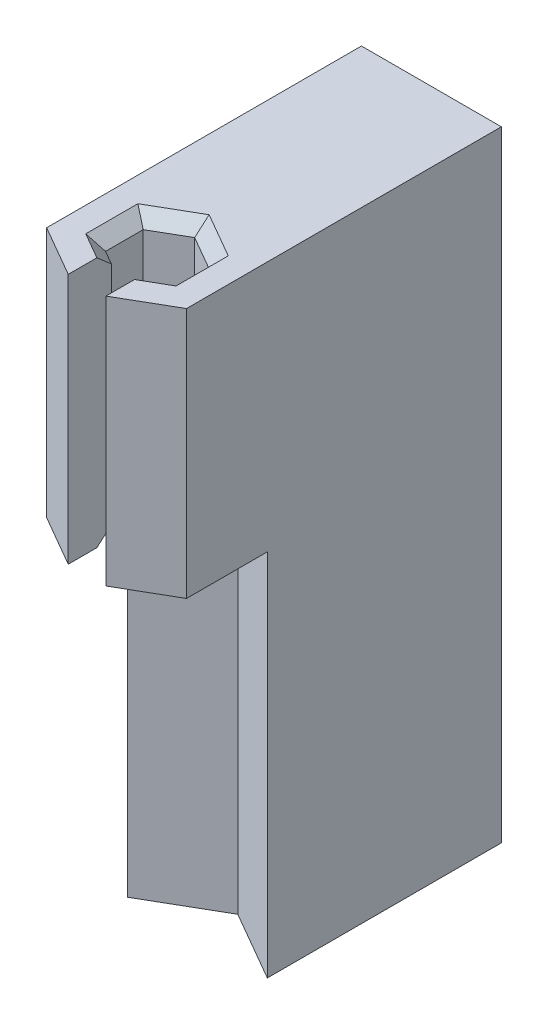
ISO-10303-21;
HEADER;
FILE_DESCRIPTION(('STEP AP214'),'2;1');
FILE_NAME('part.step','',(''),(''),'','','');
FILE_SCHEMA(('AUTOMOTIVE_DESIGN { 1 0 10303 214 1 1 1 1 }'));
ENDSEC;
DATA;
#1=APPLICATION_CONTEXT('core data for automotive mechanical design processes');
#2=APPLICATION_PROTOCOL_DEFINITION('international standard','automotive_design',2000,#1);
#3=PRODUCT_CONTEXT('',#1,'mechanical');
#4=PRODUCT('Part','Part','',(#3));
#5=PRODUCT_RELATED_PRODUCT_CATEGORY('part','',(#4));
#6=PRODUCT_DEFINITION_FORMATION('','',#4);
#7=PRODUCT_DEFINITION_CONTEXT('part definition',#1,'design');
#8=PRODUCT_DEFINITION('design','',#6,#7);
#9=PRODUCT_DEFINITION_SHAPE('','',#8);
#10=(LENGTH_UNIT() NAMED_UNIT(*) SI_UNIT(.MILLI.,.METRE.));
#11=(NAMED_UNIT(*) PLANE_ANGLE_UNIT() SI_UNIT($,.RADIAN.));
#12=(NAMED_UNIT(*) SI_UNIT($,.STERADIAN.) SOLID_ANGLE_UNIT());
#13=UNCERTAINTY_MEASURE_WITH_UNIT(LENGTH_MEASURE(1.E-05),#10,'distance_accuracy_value','');
#14=(GEOMETRIC_REPRESENTATION_CONTEXT(3) GLOBAL_UNCERTAINTY_ASSIGNED_CONTEXT((#13)) GLOBAL_UNIT_ASSIGNED_CONTEXT((#10,
#11,#12)) REPRESENTATION_CONTEXT('',''));
#15=CARTESIAN_POINT('',(0.,0.,0.));
#16=DIRECTION('',(0.,0.,1.));
#17=DIRECTION('',(1.,0.,0.));
#18=AXIS2_PLACEMENT_3D('',#15,#16,#17);
#19=CARTESIAN_POINT('',(40.2,84.02,15.9));
#20=DIRECTION('',(0.,0.,1.));
#21=DIRECTION('',(1.,0.,0.));
#22=AXIS2_PLACEMENT_3D('',#19,#20,#21);
#23=PLANE('',#22);
#24=CARTESIAN_POINT('',(63.1646241460588,78.45,15.9));
#25=DIRECTION('',(0.,0.,-1.));
#26=DIRECTION('',(-1.,0.,0.));
#27=AXIS2_PLACEMENT_3D('',#24,#25,#26);
#28=CIRCLE('',#27,0.999999999999998);
#29=CARTESIAN_POINT('',(62.1646241460588,78.45,15.9));
#30=VERTEX_POINT('',#29);
#31=EDGE_CURVE('E420',#30,#30,#28,.T.);
#32=ORIENTED_EDGE('',*,*,#31,.F.);
#33=EDGE_LOOP('',(#32));
#34=FACE_BOUND('',#33,.T.);
#35=DIRECTION('',(1.,0.,0.));
#36=VECTOR('',#35,1.);
#37=CARTESIAN_POINT('',(0.,84.02,15.9));
#38=LINE('',#37,#36);
#39=CARTESIAN_POINT('',(55.4888771993531,84.02,15.9));
#40=VERTEX_POINT('',#39);
#41=CARTESIAN_POINT('',(66.6346241460589,84.02,15.9));
#42=VERTEX_POINT('',#41);
#43=EDGE_CURVE('E11',#40,#42,#38,.T.);
#44=ORIENTED_EDGE('',*,*,#43,.T.);
#45=DIRECTION('',(0.,1.,0.));
#46=VECTOR('',#45,1.);
#47=CARTESIAN_POINT('',(66.6346241460589,84.0200000000001,15.9));
#48=LINE('',#47,#46);
#49=CARTESIAN_POINT('',(66.6346241460588,34.62,15.9));
#50=VERTEX_POINT('',#49);
#51=EDGE_CURVE('E63',#50,#42,#48,.T.);
#52=ORIENTED_EDGE('',*,*,#51,.F.);
#53=DIRECTION('',(1.,0.,0.));
#54=VECTOR('',#53,1.);
#55=CARTESIAN_POINT('',(0.,34.62,15.9));
#56=LINE('',#55,#54);
#57=CARTESIAN_POINT('',(55.4888771993531,34.62,15.9));
#58=VERTEX_POINT('',#57);
#59=EDGE_CURVE('E315',#58,#50,#56,.T.);
#60=ORIENTED_EDGE('',*,*,#59,.F.);
#61=DIRECTION('',(0.,-1.,0.));
#62=VECTOR('',#61,1.);
#63=CARTESIAN_POINT('',(55.4888771993531,84.0200000000001,15.9));
#64=LINE('',#63,#62);
#65=EDGE_CURVE('E50',#40,#58,#64,.T.);
#66=ORIENTED_EDGE('',*,*,#65,.F.);
#67=EDGE_LOOP('',(#44,#52,#60,#66));
#68=FACE_BOUND('',#67,.T.);
#69=ADVANCED_FACE('F43',(#34,#68),#23,.F.);
#70=CARTESIAN_POINT('',(61.061750672706,84.0200000000001,40.7599999999998));
#71=DIRECTION('',(-0.5,0.,-0.866025403784438));
#72=DIRECTION('',(-0.866025403784439,0.,0.5));
#73=AXIS2_PLACEMENT_3D('',#70,#71,#72);
#74=PLANE('',#73);
#75=DIRECTION('',(0.,-1.,0.));
#76=VECTOR('',#75,1.);
#77=CARTESIAN_POINT('',(63.6598268840593,84.0200000000001,39.2599999999998));
#78=LINE('',#77,#76);
#79=CARTESIAN_POINT('',(63.6598268840593,83.0200000000001,39.2599999999998));
#80=VERTEX_POINT('',#79);
#81=CARTESIAN_POINT('',(63.6598268840593,65.0200000000001,39.2599999999999));
#82=VERTEX_POINT('',#81);
#83=EDGE_CURVE('E241',#80,#82,#78,.T.);
#84=ORIENTED_EDGE('',*,*,#83,.T.);
#85=DIRECTION('',(-0.866025403784439,0.,0.5));
#86=VECTOR('',#85,1.);
#87=CARTESIAN_POINT('',(62.561750672706,65.0200000000001,39.8939745962155));
#88=LINE('',#87,#86);
#89=CARTESIAN_POINT('',(62.561750672706,65.0200000000001,39.8939745962155));
#90=VERTEX_POINT('',#89);
#91=EDGE_CURVE('E285',#82,#90,#88,.T.);
#92=ORIENTED_EDGE('',*,*,#91,.T.);
#93=DIRECTION('',(0.,-1.,0.));
#94=VECTOR('',#93,1.);
#95=CARTESIAN_POINT('',(62.561750672706,84.0200000000001,39.8939745962154));
#96=LINE('',#95,#94);
#97=CARTESIAN_POINT('',(62.561750672706,83.0200000000002,39.8939745962154));
#98=VERTEX_POINT('',#97);
#99=EDGE_CURVE('E255',#98,#90,#96,.T.);
#100=ORIENTED_EDGE('',*,*,#99,.F.);
#101=DIRECTION('',(0.866025403784439,0.,-0.5));
#102=VECTOR('',#101,1.);
#103=CARTESIAN_POINT('',(61.061750672706,83.0200000000002,40.7599999999998));
#104=LINE('',#103,#102);
#105=EDGE_CURVE('E282',#98,#80,#104,.T.);
#106=ORIENTED_EDGE('',*,*,#105,.T.);
#107=EDGE_LOOP('',(#84,#92,#100,#106));
#108=FACE_BOUND('',#107,.T.);
#109=ADVANCED_FACE('F390',(#108),#74,.T.);
#110=CARTESIAN_POINT('',(63.6598268840593,84.0200000000001,39.2599999999998));
#111=DIRECTION('',(-1.,0.,0.));
#112=DIRECTION('',(0.,0.,1.));
#113=AXIS2_PLACEMENT_3D('',#110,#111,#112);
#114=PLANE('',#113);
#115=DIRECTION('',(0.,-1.,0.));
#116=VECTOR('',#115,1.);
#117=CARTESIAN_POINT('',(63.6598268840593,84.0200000000001,36.2599999999998));
#118=LINE('',#117,#116);
#119=CARTESIAN_POINT('',(63.6598268840593,83.0200000000001,36.2599999999998));
#120=VERTEX_POINT('',#119);
#121=CARTESIAN_POINT('',(63.6598268840593,65.0200000000001,36.2599999999999));
#122=VERTEX_POINT('',#121);
#123=EDGE_CURVE('E384',#120,#122,#118,.T.);
#124=ORIENTED_EDGE('',*,*,#123,.T.);
#125=DIRECTION('',(0.,0.,1.));
#126=VECTOR('',#125,1.);
#127=CARTESIAN_POINT('',(63.6598268840593,65.0200000000001,39.2599999999999));
#128=LINE('',#127,#126);
#129=EDGE_CURVE('E293',#122,#82,#128,.T.);
#130=ORIENTED_EDGE('',*,*,#129,.T.);
#131=ORIENTED_EDGE('',*,*,#83,.F.);
#132=DIRECTION('',(0.,0.,-1.));
#133=VECTOR('',#132,1.);
#134=CARTESIAN_POINT('',(63.6598268840593,83.0200000000001,39.2599999999998));
#135=LINE('',#134,#133);
#136=EDGE_CURVE('E291',#80,#120,#135,.T.);
#137=ORIENTED_EDGE('',*,*,#136,.T.);
#138=EDGE_LOOP('',(#124,#130,#131,#137));
#139=FACE_BOUND('',#138,.T.);
#140=ADVANCED_FACE('F440',(#139),#114,.T.);
#141=CARTESIAN_POINT('',(63.6598268840593,84.0200000000001,36.2599999999998));
#142=DIRECTION('',(-0.499999999999997,0.,0.866025403784441));
#143=DIRECTION('',(0.866025403784441,0.,0.499999999999997));
#144=AXIS2_PLACEMENT_3D('',#141,#142,#143);
#145=PLANE('',#144);
#146=DIRECTION('',(0.,-1.,0.));
#147=VECTOR('',#146,1.);
#148=CARTESIAN_POINT('',(61.061750672706,84.0200000000001,34.7599999999998));
#149=LINE('',#148,#147);
#150=CARTESIAN_POINT('',(61.061750672706,83.0200000000001,34.7599999999998));
#151=VERTEX_POINT('',#150);
#152=CARTESIAN_POINT('',(61.061750672706,65.0200000000001,34.7599999999999));
#153=VERTEX_POINT('',#152);
#154=EDGE_CURVE('E381',#151,#153,#149,.T.);
#155=ORIENTED_EDGE('',*,*,#154,.T.);
#156=DIRECTION('',(0.866025403784441,0.,0.499999999999997));
#157=VECTOR('',#156,1.);
#158=CARTESIAN_POINT('',(63.6598268840593,65.0200000000001,36.2599999999999));
#159=LINE('',#158,#157);
#160=EDGE_CURVE('E297',#153,#122,#159,.T.);
#161=ORIENTED_EDGE('',*,*,#160,.T.);
#162=ORIENTED_EDGE('',*,*,#123,.F.);
#163=DIRECTION('',(-0.866025403784441,0.,-0.499999999999997));
#164=VECTOR('',#163,1.);
#165=CARTESIAN_POINT('',(63.6598268840593,83.0200000000001,36.2599999999998));
#166=LINE('',#165,#164);
#167=EDGE_CURVE('E295',#120,#151,#166,.T.);
#168=ORIENTED_EDGE('',*,*,#167,.T.);
#169=EDGE_LOOP('',(#155,#161,#162,#168));
#170=FACE_BOUND('',#169,.T.);
#171=ADVANCED_FACE('F468',(#170),#145,.T.);
#172=CARTESIAN_POINT('',(61.061750672706,84.0200000000001,34.7599999999998));
#173=DIRECTION('',(0.500000000000003,0.,0.866025403784437));
#174=DIRECTION('',(0.866025403784437,0.,-0.500000000000003));
#175=AXIS2_PLACEMENT_3D('',#172,#173,#174);
#176=PLANE('',#175);
#177=DIRECTION('',(0.,-1.,0.));
#178=VECTOR('',#177,1.);
#179=CARTESIAN_POINT('',(58.4636744613527,84.0200000000001,36.2599999999998));
#180=LINE('',#179,#178);
#181=CARTESIAN_POINT('',(58.4636744613527,83.0200000000001,36.2599999999998));
#182=VERTEX_POINT('',#181);
#183=CARTESIAN_POINT('',(58.4636744613527,65.0200000000001,36.2599999999999));
#184=VERTEX_POINT('',#183);
#185=EDGE_CURVE('E378',#182,#184,#180,.T.);
#186=ORIENTED_EDGE('',*,*,#185,.T.);
#187=DIRECTION('',(0.866025403784437,0.,-0.500000000000003));
#188=VECTOR('',#187,1.);
#189=CARTESIAN_POINT('',(61.061750672706,65.0200000000001,34.7599999999999));
#190=LINE('',#189,#188);
#191=EDGE_CURVE('E301',#184,#153,#190,.T.);
#192=ORIENTED_EDGE('',*,*,#191,.T.);
#193=ORIENTED_EDGE('',*,*,#154,.F.);
#194=DIRECTION('',(-0.866025403784437,0.,0.500000000000003));
#195=VECTOR('',#194,1.);
#196=CARTESIAN_POINT('',(61.061750672706,83.0200000000001,34.7599999999998));
#197=LINE('',#196,#195);
#198=EDGE_CURVE('E299',#151,#182,#197,.T.);
#199=ORIENTED_EDGE('',*,*,#198,.T.);
#200=EDGE_LOOP('',(#186,#192,#193,#199));
#201=FACE_BOUND('',#200,.T.);
#202=ADVANCED_FACE('F464',(#201),#176,.T.);
#203=CARTESIAN_POINT('',(58.4636744613527,84.0200000000001,36.2599999999998));
#204=DIRECTION('',(1.,0.,0.));
#205=DIRECTION('',(0.,0.,-1.));
#206=AXIS2_PLACEMENT_3D('',#203,#204,#205);
#207=PLANE('',#206);
#208=DIRECTION('',(0.,-1.,0.));
#209=VECTOR('',#208,1.);
#210=CARTESIAN_POINT('',(58.4636744613527,84.0200000000001,39.2599999999998));
#211=LINE('',#210,#209);
#212=CARTESIAN_POINT('',(58.4636744613527,83.0200000000001,39.2599999999998));
#213=VERTEX_POINT('',#212);
#214=CARTESIAN_POINT('',(58.4636744613527,65.0200000000001,39.2599999999999));
#215=VERTEX_POINT('',#214);
#216=EDGE_CURVE('E371',#213,#215,#211,.T.);
#217=ORIENTED_EDGE('',*,*,#216,.T.);
#218=DIRECTION('',(0.,0.,-1.));
#219=VECTOR('',#218,1.);
#220=CARTESIAN_POINT('',(58.4636744613527,65.0200000000001,36.2599999999999));
#221=LINE('',#220,#219);
#222=EDGE_CURVE('E280',#215,#184,#221,.T.);
#223=ORIENTED_EDGE('',*,*,#222,.T.);
#224=ORIENTED_EDGE('',*,*,#185,.F.);
#225=DIRECTION('',(0.,0.,1.));
#226=VECTOR('',#225,1.);
#227=CARTESIAN_POINT('',(58.4636744613527,83.0200000000001,36.2599999999998));
#228=LINE('',#227,#226);
#229=EDGE_CURVE('E278',#182,#213,#228,.T.);
#230=ORIENTED_EDGE('',*,*,#229,.T.);
#231=EDGE_LOOP('',(#217,#223,#224,#230));
#232=FACE_BOUND('',#231,.T.);
#233=ADVANCED_FACE('F460',(#232),#207,.T.);
#234=CARTESIAN_POINT('',(58.4636744613527,84.0200000000001,39.2599999999998));
#235=DIRECTION('',(0.499999999999999,0.,-0.866025403784439));
#236=DIRECTION('',(-0.866025403784439,0.,-0.499999999999999));
#237=AXIS2_PLACEMENT_3D('',#234,#235,#236);
#238=PLANE('',#237);
#239=DIRECTION('',(0.,1.,0.));
#240=VECTOR('',#239,1.);
#241=CARTESIAN_POINT('',(59.561750672706,59.0200000000001,39.8939745962155));
#242=LINE('',#241,#240);
#243=CARTESIAN_POINT('',(59.561750672706,65.0200000000001,39.8939745962155));
#244=VERTEX_POINT('',#243);
#245=CARTESIAN_POINT('',(59.561750672706,83.0200000000002,39.8939745962154));
#246=VERTEX_POINT('',#245);
#247=EDGE_CURVE('E220',#244,#246,#242,.T.);
#248=ORIENTED_EDGE('',*,*,#247,.F.);
#249=DIRECTION('',(-0.866025403784439,0.,-0.499999999999999));
#250=VECTOR('',#249,1.);
#251=CARTESIAN_POINT('',(58.4636744613527,65.0200000000001,39.2599999999999));
#252=LINE('',#251,#250);
#253=EDGE_CURVE('E276',#244,#215,#252,.T.);
#254=ORIENTED_EDGE('',*,*,#253,.T.);
#255=ORIENTED_EDGE('',*,*,#216,.F.);
#256=DIRECTION('',(0.866025403784439,0.,0.499999999999999));
#257=VECTOR('',#256,1.);
#258=CARTESIAN_POINT('',(58.4636744613527,83.0200000000002,39.2599999999998));
#259=LINE('',#258,#257);
#260=EDGE_CURVE('E274',#213,#246,#259,.T.);
#261=ORIENTED_EDGE('',*,*,#260,.T.);
#262=EDGE_LOOP('',(#248,#254,#255,#261));
#263=FACE_BOUND('',#262,.T.);
#264=ADVANCED_FACE('F463',(#263),#238,.T.);
#265=CARTESIAN_POINT('',(29.8169591859503,64.0200000000002,51.6444882372729));
#266=DIRECTION('',(0.353553390593274,-0.707106781186549,0.612372435695793));
#267=DIRECTION('',(0.866025403784437,0.,-0.500000000000003));
#268=AXIS2_PLACEMENT_3D('',#265,#266,#267);
#269=PLANE('',#268);
#270=DIRECTION('',(0.,0.654653670707975,0.755928946018456));
#271=VECTOR('',#270,1.);
#272=CARTESIAN_POINT('',(61.061750672706,46.7777615650565,13.6956774579278));
#273=LINE('',#272,#271);
#274=CARTESIAN_POINT('',(61.061750672706,64.0200000000001,33.6052994616206));
#275=VERTEX_POINT('',#274);
#276=EDGE_CURVE('E323',#275,#153,#273,.T.);
#277=ORIENTED_EDGE('',*,*,#276,.T.);
#278=ORIENTED_EDGE('',*,*,#191,.F.);
#279=DIRECTION('',(-0.65465367070798,-0.654653670707975,-0.377964473009225));
#280=VECTOR('',#279,1.);
#281=CARTESIAN_POINT('',(48.6345084210029,55.1908339596504,30.5851283406945));
#282=LINE('',#281,#280);
#283=CARTESIAN_POINT('',(57.4636744613527,64.0200000000001,35.6826497308103));
#284=VERTEX_POINT('',#283);
#285=EDGE_CURVE('E319',#284,#184,#282,.F.);
#286=ORIENTED_EDGE('',*,*,#285,.F.);
#287=DIRECTION('',(-0.866025403784437,0.,0.500000000000003));
#288=VECTOR('',#287,1.);
#289=CARTESIAN_POINT('',(57.9636744613527,64.0200000000001,35.3939745962155));
#290=LINE('',#289,#288);
#291=EDGE_CURVE('E258',#275,#284,#290,.T.);
#292=ORIENTED_EDGE('',*,*,#291,.F.);
#293=EDGE_LOOP('',(#277,#278,#286,#292));
#294=FACE_BOUND('',#293,.T.);
#295=ADVANCED_FACE('F477',(#294),#269,.T.);
#296=CARTESIAN_POINT('',(0.713916150402727,64.0199999999999,-1.2365390448418));
#297=DIRECTION('',(-0.353553390593268,-0.707106781186552,0.612372435695793));
#298=DIRECTION('',(0.866025403784441,0.,0.499999999999997));
#299=AXIS2_PLACEMENT_3D('',#296,#297,#298);
#300=PLANE('',#299);
#301=DIRECTION('',(-0.654653670707974,0.654653670707974,0.377964473009237));
#302=VECTOR('',#301,1.);
#303=CARTESIAN_POINT('',(73.4889929244093,55.1908339596501,30.5851283406942));
#304=LINE('',#303,#302);
#305=CARTESIAN_POINT('',(64.6598268840593,64.0200000000001,35.6826497308103));
#306=VERTEX_POINT('',#305);
#307=EDGE_CURVE('E326',#306,#122,#304,.T.);
#308=ORIENTED_EDGE('',*,*,#307,.T.);
#309=ORIENTED_EDGE('',*,*,#160,.F.);
#310=ORIENTED_EDGE('',*,*,#276,.F.);
#311=DIRECTION('',(-0.866025403784441,0.,-0.499999999999997));
#312=VECTOR('',#311,1.);
#313=CARTESIAN_POINT('',(61.561750672706,64.0200000000001,33.8939745962155));
#314=LINE('',#313,#312);
#315=EDGE_CURVE('E260',#306,#275,#314,.T.);
#316=ORIENTED_EDGE('',*,*,#315,.F.);
#317=EDGE_LOOP('',(#308,#309,#310,#316));
#318=FACE_BOUND('',#317,.T.);
#319=ADVANCED_FACE('F513',(#318),#300,.T.);
#320=CARTESIAN_POINT('',(64.6598268840593,64.0199999999999,-2.76132393304207E-13));
#321=DIRECTION('',(-0.707106781186547,-0.707106781186549,0.));
#322=DIRECTION('',(0.,0.,1.));
#323=AXIS2_PLACEMENT_3D('',#320,#321,#322);
#324=PLANE('',#323);
#325=DIRECTION('',(-0.654653670707982,0.654653670707979,-0.377964473009215));
#326=VECTOR('',#325,1.);
#327=CARTESIAN_POINT('',(55.7327436021287,72.9470832819306,34.6832963332889));
#328=LINE('',#327,#326);
#329=CARTESIAN_POINT('',(64.6598268840593,64.0200000000001,39.8373502691895));
#330=VERTEX_POINT('',#329);
#331=EDGE_CURVE('E210',#330,#82,#328,.T.);
#332=ORIENTED_EDGE('',*,*,#331,.T.);
#333=ORIENTED_EDGE('',*,*,#129,.F.);
#334=ORIENTED_EDGE('',*,*,#307,.F.);
#335=DIRECTION('',(0.,0.,-1.));
#336=VECTOR('',#335,1.);
#337=CARTESIAN_POINT('',(64.6598268840593,64.0200000000001,36.2599999999999));
#338=LINE('',#337,#336);
#339=EDGE_CURVE('E262',#330,#306,#338,.T.);
#340=ORIENTED_EDGE('',*,*,#339,.F.);
#341=EDGE_LOOP('',(#332,#333,#334,#340));
#342=FACE_BOUND('',#341,.T.);
#343=ADVANCED_FACE('F402',(#342),#324,.T.);
#344=CARTESIAN_POINT('',(33.4150353973035,64.0200000000002,57.8765390448418));
#345=DIRECTION('',(-0.353553390593278,-0.707106781186543,-0.612372435695798));
#346=DIRECTION('',(-0.866025403784439,0.,0.5));
#347=AXIS2_PLACEMENT_3D('',#344,#345,#346);
#348=PLANE('',#347);
#349=DIRECTION('',(0.,-0.654653670707982,0.755928946018451));
#350=VECTOR('',#349,1.);
#351=CARTESIAN_POINT('',(62.561750672706,55.6923670641708,50.6645973690215));
#352=LINE('',#351,#350);
#353=CARTESIAN_POINT('',(62.561750672706,64.0200000000001,41.0486751345947));
#354=VERTEX_POINT('',#353);
#355=EDGE_CURVE('E289',#90,#354,#352,.T.);
#356=ORIENTED_EDGE('',*,*,#355,.F.);
#357=ORIENTED_EDGE('',*,*,#91,.F.);
#358=ORIENTED_EDGE('',*,*,#331,.F.);
#359=DIRECTION('',(0.866025403784439,0.,-0.5));
#360=VECTOR('',#359,1.);
#361=CARTESIAN_POINT('',(64.1598268840593,64.0200000000001,40.1260254037843));
#362=LINE('',#361,#360);
#363=EDGE_CURVE('E264',#354,#330,#362,.T.);
#364=ORIENTED_EDGE('',*,*,#363,.F.);
#365=EDGE_LOOP('',(#356,#357,#358,#364));
#366=FACE_BOUND('',#365,.T.);
#367=ADVANCED_FACE('F397',(#366),#348,.T.);
#368=CARTESIAN_POINT('',(-2.88416006095048,64.02,4.99551176272692));
#369=DIRECTION('',(0.353553390593274,-0.707106781186548,-0.612372435695793));
#370=DIRECTION('',(-0.866025403784439,0.,-0.499999999999999));
#371=AXIS2_PLACEMENT_3D('',#368,#369,#370);
#372=PLANE('',#371);
#373=DIRECTION('',(-0.654653670707983,-0.654653670707974,0.377964473009222));
#374=VECTOR('',#373,1.);
#375=CARTESIAN_POINT('',(40.2214360264083,46.777761565056,49.7921612710362));
#376=LINE('',#375,#374);
#377=CARTESIAN_POINT('',(57.4636744613527,64.0200000000001,39.8373502691896));
#378=VERTEX_POINT('',#377);
#379=EDGE_CURVE('E316',#378,#215,#376,.F.);
#380=ORIENTED_EDGE('',*,*,#379,.T.);
#381=ORIENTED_EDGE('',*,*,#253,.F.);
#382=DIRECTION('',(0.,0.654653670707976,-0.755928946018455));
#383=VECTOR('',#382,1.);
#384=CARTESIAN_POINT('',(59.561750672706,81.8616887810447,20.4468674935274));
#385=LINE('',#384,#383);
#386=CARTESIAN_POINT('',(59.561750672706,64.0200000000001,41.0486751345947));
#387=VERTEX_POINT('',#386);
#388=EDGE_CURVE('E272',#387,#244,#385,.T.);
#389=ORIENTED_EDGE('',*,*,#388,.F.);
#390=DIRECTION('',(0.866025403784439,0.,0.499999999999999));
#391=VECTOR('',#390,1.);
#392=CARTESIAN_POINT('',(59.061750672706,64.0200000000001,40.7599999999999));
#393=LINE('',#392,#391);
#394=EDGE_CURVE('E268',#378,#387,#393,.T.);
#395=ORIENTED_EDGE('',*,*,#394,.F.);
#396=EDGE_LOOP('',(#380,#381,#389,#395));
#397=FACE_BOUND('',#396,.T.);
#398=ADVANCED_FACE('F492',(#397),#372,.T.);
#399=CARTESIAN_POINT('',(57.4636744613527,64.0199999999999,-2.76132393304207E-13));
#400=DIRECTION('',(0.707106781186544,-0.707106781186551,0.));
#401=DIRECTION('',(0.,0.,-1.));
#402=AXIS2_PLACEMENT_3D('',#399,#400,#401);
#403=PLANE('',#402);
#404=ORIENTED_EDGE('',*,*,#285,.T.);
#405=ORIENTED_EDGE('',*,*,#222,.F.);
#406=ORIENTED_EDGE('',*,*,#379,.F.);
#407=DIRECTION('',(0.,0.,1.));
#408=VECTOR('',#407,1.);
#409=CARTESIAN_POINT('',(57.4636744613527,64.0200000000001,39.2599999999999));
#410=LINE('',#409,#408);
#411=EDGE_CURVE('E266',#284,#378,#410,.T.);
#412=ORIENTED_EDGE('',*,*,#411,.F.);
#413=EDGE_LOOP('',(#404,#405,#406,#412));
#414=FACE_BOUND('',#413,.T.);
#415=ADVANCED_FACE('F499',(#414),#403,.T.);
#416=CARTESIAN_POINT('',(62.561750672706,59.0200000000001,39.8939745962155));
#417=DIRECTION('',(1.,0.,0.));
#418=DIRECTION('',(0.,0.,-1.));
#419=AXIS2_PLACEMENT_3D('',#416,#417,#418);
#420=PLANE('',#419);
#421=ORIENTED_EDGE('',*,*,#99,.T.);
#422=ORIENTED_EDGE('',*,*,#355,.T.);
#423=DIRECTION('',(0.,0.,-1.));
#424=VECTOR('',#423,1.);
#425=CARTESIAN_POINT('',(62.561750672706,64.0199999999999,-2.76132393304207E-13));
#426=LINE('',#425,#424);
#427=CARTESIAN_POINT('',(62.561750672706,64.0200000000001,43.3289745962154));
#428=VERTEX_POINT('',#427);
#429=EDGE_CURVE('E410',#428,#354,#426,.T.);
#430=ORIENTED_EDGE('',*,*,#429,.F.);
#431=DIRECTION('',(0.,1.,0.));
#432=VECTOR('',#431,1.);
#433=CARTESIAN_POINT('',(62.561750672706,59.0200000000001,43.3289745962155));
#434=LINE('',#433,#432);
#435=CARTESIAN_POINT('',(62.561750672706,84.0200000000001,43.3289745962154));
#436=VERTEX_POINT('',#435);
#437=EDGE_CURVE('E219',#428,#436,#434,.T.);
#438=ORIENTED_EDGE('',*,*,#437,.T.);
#439=DIRECTION('',(0.,0.,-1.));
#440=VECTOR('',#439,1.);
#441=CARTESIAN_POINT('',(62.561750672706,84.0200000000001,39.8939745962154));
#442=LINE('',#441,#440);
#443=CARTESIAN_POINT('',(62.561750672706,84.0200000000001,41.0486751345946));
#444=VERTEX_POINT('',#443);
#445=EDGE_CURVE('E209',#436,#444,#442,.T.);
#446=ORIENTED_EDGE('',*,*,#445,.T.);
#447=DIRECTION('',(0.,0.654653670707974,0.755928946018458));
#448=VECTOR('',#447,1.);
#449=CARTESIAN_POINT('',(62.561750672706,83.4485714285716,40.3888462555208));
#450=LINE('',#449,#448);
#451=EDGE_CURVE('E287',#444,#98,#450,.F.);
#452=ORIENTED_EDGE('',*,*,#451,.T.);
#453=EDGE_LOOP('',(#421,#422,#430,#438,#446,#452));
#454=FACE_BOUND('',#453,.T.);
#455=ADVANCED_FACE('F506',(#454),#420,.F.);
#456=CARTESIAN_POINT('',(61.061750672706,83.0200000000002,40.7599999999998));
#457=DIRECTION('',(0.353553390593271,-0.707106781186551,0.612372435695792));
#458=DIRECTION('',(0.866025403784439,0.,-0.5));
#459=AXIS2_PLACEMENT_3D('',#456,#457,#458);
#460=PLANE('',#459);
#461=ORIENTED_EDGE('',*,*,#451,.F.);
#462=DIRECTION('',(-0.866025403784439,0.,0.5));
#463=VECTOR('',#462,1.);
#464=CARTESIAN_POINT('',(33.4150353973034,84.0200000000002,57.8765390448417));
#465=LINE('',#464,#463);
#466=CARTESIAN_POINT('',(64.6598268840593,84.0200000000001,39.8373502691894));
#467=VERTEX_POINT('',#466);
#468=EDGE_CURVE('E313',#467,#444,#465,.T.);
#469=ORIENTED_EDGE('',*,*,#468,.F.);
#470=DIRECTION('',(0.654653670707979,0.654653670707973,0.377964473009231));
#471=VECTOR('',#470,1.);
#472=CARTESIAN_POINT('',(62.9175193951012,82.2776925110421,38.8314285714284));
#473=LINE('',#472,#471);
#474=EDGE_CURVE('E331',#467,#80,#473,.F.);
#475=ORIENTED_EDGE('',*,*,#474,.T.);
#476=ORIENTED_EDGE('',*,*,#105,.F.);
#477=EDGE_LOOP('',(#461,#469,#475,#476));
#478=FACE_BOUND('',#477,.T.);
#479=ADVANCED_FACE('F531',(#478),#460,.F.);
#480=CARTESIAN_POINT('',(63.6598268840593,83.0200000000001,39.2599999999998));
#481=DIRECTION('',(0.707106781186544,-0.707106781186551,0.));
#482=DIRECTION('',(0.,0.,-1.));
#483=AXIS2_PLACEMENT_3D('',#480,#481,#482);
#484=PLANE('',#483);
#485=DIRECTION('',(0.654653670707981,0.654653670707972,-0.377964473009231));
#486=VECTOR('',#485,1.);
#487=CARTESIAN_POINT('',(62.9175193951012,82.277692511042,36.6885714285713));
#488=LINE('',#487,#486);
#489=CARTESIAN_POINT('',(64.6598268840593,84.0200000000001,35.6826497308102));
#490=VERTEX_POINT('',#489);
#491=EDGE_CURVE('E333',#490,#120,#488,.F.);
#492=ORIENTED_EDGE('',*,*,#491,.T.);
#493=ORIENTED_EDGE('',*,*,#136,.F.);
#494=ORIENTED_EDGE('',*,*,#474,.F.);
#495=DIRECTION('',(0.,0.,1.));
#496=VECTOR('',#495,1.);
#497=CARTESIAN_POINT('',(64.6598268840593,84.0199999999999,-3.59651526743793E-13));
#498=LINE('',#497,#496);
#499=EDGE_CURVE('E311',#490,#467,#498,.T.);
#500=ORIENTED_EDGE('',*,*,#499,.F.);
#501=EDGE_LOOP('',(#492,#493,#494,#500));
#502=FACE_BOUND('',#501,.T.);
#503=ADVANCED_FACE('F537',(#502),#484,.F.);
#504=CARTESIAN_POINT('',(63.6598268840593,83.0200000000001,36.2599999999998));
#505=DIRECTION('',(0.35355339059327,-0.707106781186553,-0.612372435695791));
#506=DIRECTION('',(-0.866025403784441,0.,-0.499999999999997));
#507=AXIS2_PLACEMENT_3D('',#504,#505,#506);
#508=PLANE('',#507);
#509=DIRECTION('',(0.,0.654653670707967,-0.755928946018463));
#510=VECTOR('',#509,1.);
#511=CARTESIAN_POINT('',(61.061750672706,82.277692511042,35.6171428571427));
#512=LINE('',#511,#510);
#513=CARTESIAN_POINT('',(61.061750672706,84.0200000000001,33.6052994616206));
#514=VERTEX_POINT('',#513);
#515=EDGE_CURVE('E337',#514,#151,#512,.F.);
#516=ORIENTED_EDGE('',*,*,#515,.T.);
#517=ORIENTED_EDGE('',*,*,#167,.F.);
#518=ORIENTED_EDGE('',*,*,#491,.F.);
#519=DIRECTION('',(0.866025403784441,0.,0.499999999999997));
#520=VECTOR('',#519,1.);
#521=CARTESIAN_POINT('',(0.713916150402708,84.0199999999999,-1.23653904484185));
#522=LINE('',#521,#520);
#523=EDGE_CURVE('E305',#514,#490,#522,.T.);
#524=ORIENTED_EDGE('',*,*,#523,.F.);
#525=EDGE_LOOP('',(#516,#517,#518,#524));
#526=FACE_BOUND('',#525,.T.);
#527=ADVANCED_FACE('F544',(#526),#508,.F.);
#528=CARTESIAN_POINT('',(61.061750672706,83.0200000000001,34.7599999999998));
#529=DIRECTION('',(-0.353553390593271,-0.70710678118656,-0.612372435695782));
#530=DIRECTION('',(-0.866025403784437,0.,0.500000000000003));
#531=AXIS2_PLACEMENT_3D('',#528,#529,#530);
#532=PLANE('',#531);
#533=DIRECTION('',(0.654653670707977,-0.654653670707969,0.377964473009242));
#534=VECTOR('',#533,1.);
#535=CARTESIAN_POINT('',(58.4636744613527,83.0200000000001,36.2599999999998));
#536=LINE('',#535,#534);
#537=CARTESIAN_POINT('',(57.4636744613527,84.0200000000001,35.6826497308102));
#538=VERTEX_POINT('',#537);
#539=EDGE_CURVE('E340',#538,#182,#536,.T.);
#540=ORIENTED_EDGE('',*,*,#539,.T.);
#541=ORIENTED_EDGE('',*,*,#198,.F.);
#542=ORIENTED_EDGE('',*,*,#515,.F.);
#543=DIRECTION('',(0.866025403784437,0.,-0.500000000000003));
#544=VECTOR('',#543,1.);
#545=CARTESIAN_POINT('',(29.8169591859503,84.0200000000002,51.6444882372728));
#546=LINE('',#545,#544);
#547=EDGE_CURVE('E303',#538,#514,#546,.T.);
#548=ORIENTED_EDGE('',*,*,#547,.F.);
#549=EDGE_LOOP('',(#540,#541,#542,#548));
#550=FACE_BOUND('',#549,.T.);
#551=ADVANCED_FACE('F551',(#550),#532,.F.);
#552=CARTESIAN_POINT('',(58.4636744613527,83.0200000000001,36.2599999999998));
#553=DIRECTION('',(-0.707106781186544,-0.707106781186551,0.));
#554=DIRECTION('',(0.,0.,1.));
#555=AXIS2_PLACEMENT_3D('',#552,#553,#554);
#556=PLANE('',#555);
#557=DIRECTION('',(0.654653670707979,-0.654653670707974,-0.37796447300923));
#558=VECTOR('',#557,1.);
#559=CARTESIAN_POINT('',(58.4636744613527,83.0200000000002,39.2599999999998));
#560=LINE('',#559,#558);
#561=CARTESIAN_POINT('',(57.4636744613527,84.0200000000001,39.8373502691894));
#562=VERTEX_POINT('',#561);
#563=EDGE_CURVE('E320',#562,#213,#560,.T.);
#564=ORIENTED_EDGE('',*,*,#563,.T.);
#565=ORIENTED_EDGE('',*,*,#229,.F.);
#566=ORIENTED_EDGE('',*,*,#539,.F.);
#567=DIRECTION('',(0.,0.,-1.));
#568=VECTOR('',#567,1.);
#569=CARTESIAN_POINT('',(57.4636744613527,84.0199999999999,-3.59651526743793E-13));
#570=LINE('',#569,#568);
#571=EDGE_CURVE('E307',#562,#538,#570,.T.);
#572=ORIENTED_EDGE('',*,*,#571,.F.);
#573=EDGE_LOOP('',(#564,#565,#566,#572));
#574=FACE_BOUND('',#573,.T.);
#575=ADVANCED_FACE('F558',(#574),#556,.F.);
#576=CARTESIAN_POINT('',(58.4636744613527,83.0200000000002,39.2599999999998));
#577=DIRECTION('',(-0.35355339059327,-0.70710678118655,0.612372435695793));
#578=DIRECTION('',(0.866025403784439,0.,0.499999999999999));
#579=AXIS2_PLACEMENT_3D('',#576,#577,#578);
#580=PLANE('',#579);
#581=DIRECTION('',(0.,-0.654653670707975,-0.755928946018457));
#582=VECTOR('',#581,1.);
#583=CARTESIAN_POINT('',(59.561750672706,82.7062639396135,39.5317033983779));
#584=LINE('',#583,#582);
#585=CARTESIAN_POINT('',(59.561750672706,84.0200000000001,41.0486751345946));
#586=VERTEX_POINT('',#585);
#587=EDGE_CURVE('E205',#246,#586,#584,.F.);
#588=ORIENTED_EDGE('',*,*,#587,.F.);
#589=ORIENTED_EDGE('',*,*,#260,.F.);
#590=ORIENTED_EDGE('',*,*,#563,.F.);
#591=DIRECTION('',(-0.866025403784439,0.,-0.499999999999999));
#592=VECTOR('',#591,1.);
#593=CARTESIAN_POINT('',(-2.88416006095046,84.02,4.9955117627268));
#594=LINE('',#593,#592);
#595=EDGE_CURVE('E309',#586,#562,#594,.T.);
#596=ORIENTED_EDGE('',*,*,#595,.F.);
#597=EDGE_LOOP('',(#588,#589,#590,#596));
#598=FACE_BOUND('',#597,.T.);
#599=ADVANCED_FACE('F563',(#598),#580,.F.);
#600=CARTESIAN_POINT('',(59.561750672706,59.0200000000001,39.8939745962155));
#601=DIRECTION('',(-1.,0.,0.));
#602=DIRECTION('',(0.,0.,1.));
#603=AXIS2_PLACEMENT_3D('',#600,#601,#602);
#604=PLANE('',#603);
#605=DIRECTION('',(0.,0.,1.));
#606=VECTOR('',#605,1.);
#607=CARTESIAN_POINT('',(59.561750672706,64.0199999999999,-2.76132393304207E-13));
#608=LINE('',#607,#606);
#609=CARTESIAN_POINT('',(59.561750672706,64.0200000000001,43.3289745962155));
#610=VERTEX_POINT('',#609);
#611=EDGE_CURVE('E362',#387,#610,#608,.T.);
#612=ORIENTED_EDGE('',*,*,#611,.F.);
#613=ORIENTED_EDGE('',*,*,#388,.T.);
#614=ORIENTED_EDGE('',*,*,#247,.T.);
#615=ORIENTED_EDGE('',*,*,#587,.T.);
#616=DIRECTION('',(0.,0.,1.));
#617=VECTOR('',#616,1.);
#618=CARTESIAN_POINT('',(59.561750672706,84.0200000000001,39.8939745962154));
#619=LINE('',#618,#617);
#620=CARTESIAN_POINT('',(59.561750672706,84.0200000000001,43.3289745962154));
#621=VERTEX_POINT('',#620);
#622=EDGE_CURVE('E197',#586,#621,#619,.T.);
#623=ORIENTED_EDGE('',*,*,#622,.T.);
#624=DIRECTION('',(0.,1.,0.));
#625=VECTOR('',#624,1.);
#626=CARTESIAN_POINT('',(59.561750672706,59.0200000000001,43.3289745962155));
#627=LINE('',#626,#625);
#628=EDGE_CURVE('E201',#610,#621,#627,.T.);
#629=ORIENTED_EDGE('',*,*,#628,.F.);
#630=EDGE_LOOP('',(#612,#613,#614,#615,#623,#629));
#631=FACE_BOUND('',#630,.T.);
#632=ADVANCED_FACE('F200',(#631),#604,.F.);
#633=CARTESIAN_POINT('',(55.4888771993531,84.0200000000001,40.9774999999998));
#634=DIRECTION('',(0.500000000000003,0.,-0.866025403784437));
#635=DIRECTION('',(-0.866025403784437,0.,-0.500000000000003));
#636=AXIS2_PLACEMENT_3D('',#633,#634,#635);
#637=PLANE('',#636);
#638=DIRECTION('',(0.866025403784437,0.,0.500000000000003));
#639=VECTOR('',#638,1.);
#640=CARTESIAN_POINT('',(55.4888771993531,64.0200000000001,40.9774999999999));
#641=LINE('',#640,#639);
#642=CARTESIAN_POINT('',(55.4888771993531,64.0200000000001,40.9774999999999));
#643=VERTEX_POINT('',#642);
#644=EDGE_CURVE('E218',#643,#610,#641,.T.);
#645=ORIENTED_EDGE('',*,*,#644,.T.);
#646=ORIENTED_EDGE('',*,*,#628,.T.);
#647=DIRECTION('',(0.866025403784437,0.,0.500000000000003));
#648=VECTOR('',#647,1.);
#649=CARTESIAN_POINT('',(55.4888771993531,84.0200000000001,40.9774999999998));
#650=LINE('',#649,#648);
#651=CARTESIAN_POINT('',(55.4888771993531,84.0200000000001,40.9774999999998));
#652=VERTEX_POINT('',#651);
#653=EDGE_CURVE('E216',#652,#621,#650,.T.);
#654=ORIENTED_EDGE('',*,*,#653,.F.);
#655=DIRECTION('',(0.,-1.,0.));
#656=VECTOR('',#655,1.);
#657=CARTESIAN_POINT('',(55.4888771993531,84.0200000000001,40.9774999999998));
#658=LINE('',#657,#656);
#659=EDGE_CURVE('E253',#652,#643,#658,.T.);
#660=ORIENTED_EDGE('',*,*,#659,.T.);
#661=EDGE_LOOP('',(#645,#646,#654,#660));
#662=FACE_BOUND('',#661,.T.);
#663=ADVANCED_FACE('F214',(#662),#637,.F.);
#664=CARTESIAN_POINT('',(0.,64.0199999999999,-2.76132393304207E-13));
#665=DIRECTION('',(0.,1.,0.));
#666=DIRECTION('',(0.,0.,1.));
#667=AXIS2_PLACEMENT_3D('',#664,#665,#666);
#668=PLANE('',#667);
#669=ORIENTED_EDGE('',*,*,#411,.T.);
#670=ORIENTED_EDGE('',*,*,#394,.T.);
#671=ORIENTED_EDGE('',*,*,#611,.T.);
#672=ORIENTED_EDGE('',*,*,#644,.F.);
#673=DIRECTION('',(0.,0.,1.));
#674=VECTOR('',#673,1.);
#675=CARTESIAN_POINT('',(55.4888771993531,64.0200000000001,34.5424999999999));
#676=LINE('',#675,#674);
#677=CARTESIAN_POINT('',(55.4888771993531,64.0200000000001,34.5424999999999));
#678=VERTEX_POINT('',#677);
#679=EDGE_CURVE('E244',#678,#643,#676,.T.);
#680=ORIENTED_EDGE('',*,*,#679,.F.);
#681=DIRECTION('',(-0.866025403784438,0.,0.5));
#682=VECTOR('',#681,1.);
#683=CARTESIAN_POINT('',(61.061750672706,64.0200000000001,31.3249999999999));
#684=LINE('',#683,#682);
#685=CARTESIAN_POINT('',(61.061750672706,64.0200000000001,31.3249999999999));
#686=VERTEX_POINT('',#685);
#687=EDGE_CURVE('E240',#686,#678,#684,.T.);
#688=ORIENTED_EDGE('',*,*,#687,.F.);
#689=DIRECTION('',(-0.866025403784441,0.,-0.499999999999996));
#690=VECTOR('',#689,1.);
#691=CARTESIAN_POINT('',(66.6346241460589,64.0200000000001,34.5424999999999));
#692=LINE('',#691,#690);
#693=CARTESIAN_POINT('',(66.6346241460589,64.0200000000001,34.5424999999999));
#694=VERTEX_POINT('',#693);
#695=EDGE_CURVE('E237',#694,#686,#692,.T.);
#696=ORIENTED_EDGE('',*,*,#695,.F.);
#697=DIRECTION('',(0.,0.,-1.));
#698=VECTOR('',#697,1.);
#699=CARTESIAN_POINT('',(66.6346241460589,64.0200000000001,40.9774999999999));
#700=LINE('',#699,#698);
#701=CARTESIAN_POINT('',(66.6346241460589,64.0200000000001,40.9774999999999));
#702=VERTEX_POINT('',#701);
#703=EDGE_CURVE('E230',#702,#694,#700,.T.);
#704=ORIENTED_EDGE('',*,*,#703,.F.);
#705=DIRECTION('',(0.86602540378444,0.,-0.499999999999998));
#706=VECTOR('',#705,1.);
#707=CARTESIAN_POINT('',(61.061750672706,64.0200000000001,44.1949999999999));
#708=LINE('',#707,#706);
#709=EDGE_CURVE('E247',#428,#702,#708,.T.);
#710=ORIENTED_EDGE('',*,*,#709,.F.);
#711=ORIENTED_EDGE('',*,*,#429,.T.);
#712=ORIENTED_EDGE('',*,*,#363,.T.);
#713=ORIENTED_EDGE('',*,*,#339,.T.);
#714=ORIENTED_EDGE('',*,*,#315,.T.);
#715=ORIENTED_EDGE('',*,*,#291,.T.);
#716=EDGE_LOOP('',(#669,#670,#671,#672,#680,#688,#696,#704,#710,#711,#712,#713,#714,#715));
#717=FACE_BOUND('',#716,.T.);
#718=ADVANCED_FACE('F406',(#717),#668,.F.);
#719=CARTESIAN_POINT('',(61.061750672706,84.0200000000001,44.1949999999998));
#720=DIRECTION('',(-0.499999999999998,0.,-0.86602540378444));
#721=DIRECTION('',(-0.86602540378444,0.,0.499999999999998));
#722=AXIS2_PLACEMENT_3D('',#719,#720,#721);
#723=PLANE('',#722);
#724=DIRECTION('',(0.86602540378444,0.,-0.499999999999998));
#725=VECTOR('',#724,1.);
#726=CARTESIAN_POINT('',(61.061750672706,84.0200000000001,44.1949999999998));
#727=LINE('',#726,#725);
#728=CARTESIAN_POINT('',(66.6346241460589,84.0200000000001,40.9774999999998));
#729=VERTEX_POINT('',#728);
#730=EDGE_CURVE('E226',#436,#729,#727,.T.);
#731=ORIENTED_EDGE('',*,*,#730,.F.);
#732=ORIENTED_EDGE('',*,*,#437,.F.);
#733=ORIENTED_EDGE('',*,*,#709,.T.);
#734=DIRECTION('',(0.,-1.,0.));
#735=VECTOR('',#734,1.);
#736=CARTESIAN_POINT('',(66.6346241460589,84.0200000000001,40.9774999999998));
#737=LINE('',#736,#735);
#738=EDGE_CURVE('E236',#729,#702,#737,.T.);
#739=ORIENTED_EDGE('',*,*,#738,.F.);
#740=EDGE_LOOP('',(#731,#732,#733,#739));
#741=FACE_BOUND('',#740,.T.);
#742=ADVANCED_FACE('F481',(#741),#723,.F.);
#743=CARTESIAN_POINT('',(0.,84.0199999999999,-3.59651526743793E-13));
#744=DIRECTION('',(0.,1.,0.));
#745=DIRECTION('',(0.,0.,1.));
#746=AXIS2_PLACEMENT_3D('',#743,#744,#745);
#747=PLANE('',#746);
#748=ORIENTED_EDGE('',*,*,#43,.F.);
#749=DIRECTION('',(0.,0.,1.));
#750=VECTOR('',#749,1.);
#751=CARTESIAN_POINT('',(55.4888771993531,84.0200000000001,34.5424999999998));
#752=LINE('',#751,#750);
#753=EDGE_CURVE('E224',#40,#652,#752,.T.);
#754=ORIENTED_EDGE('',*,*,#753,.T.);
#755=ORIENTED_EDGE('',*,*,#653,.T.);
#756=ORIENTED_EDGE('',*,*,#622,.F.);
#757=ORIENTED_EDGE('',*,*,#595,.T.);
#758=ORIENTED_EDGE('',*,*,#571,.T.);
#759=ORIENTED_EDGE('',*,*,#547,.T.);
#760=ORIENTED_EDGE('',*,*,#523,.T.);
#761=ORIENTED_EDGE('',*,*,#499,.T.);
#762=ORIENTED_EDGE('',*,*,#468,.T.);
#763=ORIENTED_EDGE('',*,*,#445,.F.);
#764=ORIENTED_EDGE('',*,*,#730,.T.);
#765=DIRECTION('',(0.,0.,-1.));
#766=VECTOR('',#765,1.);
#767=CARTESIAN_POINT('',(66.6346241460589,84.0200000000001,40.9774999999998));
#768=LINE('',#767,#766);
#769=EDGE_CURVE('E228',#729,#42,#768,.T.);
#770=ORIENTED_EDGE('',*,*,#769,.T.);
#771=EDGE_LOOP('',(#748,#754,#755,#756,#757,#758,#759,#760,#761,#762,#763,#764,#770));
#772=FACE_BOUND('',#771,.T.);
#773=ADVANCED_FACE('F222',(#772),#747,.T.);
#774=CARTESIAN_POINT('',(28.8295605549504,34.6200000000002,49.9342636410574));
#775=DIRECTION('',(-0.5,0.,-0.866025403784438));
#776=DIRECTION('',(-0.866025403784438,0.,0.5));
#777=AXIS2_PLACEMENT_3D('',#774,#775,#776);
#778=PLANE('',#777);
#779=DIRECTION('',(0.,1.,0.));
#780=VECTOR('',#779,1.);
#781=CARTESIAN_POINT('',(61.061750672706,34.6200000000001,31.325));
#782=LINE('',#781,#780);
#783=CARTESIAN_POINT('',(61.061750672706,34.6200000000001,31.325));
#784=VERTEX_POINT('',#783);
#785=EDGE_CURVE('E372',#784,#686,#782,.T.);
#786=ORIENTED_EDGE('',*,*,#785,.T.);
#787=ORIENTED_EDGE('',*,*,#687,.T.);
#788=DIRECTION('',(0.,1.,0.));
#789=VECTOR('',#788,1.);
#790=CARTESIAN_POINT('',(55.4888771993531,34.6200000000001,34.5425));
#791=LINE('',#790,#789);
#792=CARTESIAN_POINT('',(55.4888771993531,34.6200000000001,34.5425));
#793=VERTEX_POINT('',#792);
#794=EDGE_CURVE('E367',#793,#678,#791,.T.);
#795=ORIENTED_EDGE('',*,*,#794,.F.);
#796=DIRECTION('',(-0.866025403784438,0.,0.5));
#797=VECTOR('',#796,1.);
#798=CARTESIAN_POINT('',(28.8295605549504,34.6200000000002,49.9342636410574));
#799=LINE('',#798,#797);
#800=EDGE_CURVE('E356',#784,#793,#799,.T.);
#801=ORIENTED_EDGE('',*,*,#800,.F.);
#802=EDGE_LOOP('',(#786,#787,#795,#801));
#803=FACE_BOUND('',#802,.T.);
#804=ADVANCED_FACE('F455',(#803),#778,.F.);
#805=CARTESIAN_POINT('',(1.70131478140247,34.6199999999999,-2.94676364105721));
#806=DIRECTION('',(0.499999999999996,0.,-0.866025403784441));
#807=DIRECTION('',(-0.866025403784441,0.,-0.499999999999996));
#808=AXIS2_PLACEMENT_3D('',#805,#806,#807);
#809=PLANE('',#808);
#810=DIRECTION('',(0.,1.,0.));
#811=VECTOR('',#810,1.);
#812=CARTESIAN_POINT('',(66.6346241460589,34.6200000000001,34.5425));
#813=LINE('',#812,#811);
#814=CARTESIAN_POINT('',(66.6346241460589,34.6200000000001,34.5425));
#815=VERTEX_POINT('',#814);
#816=EDGE_CURVE('E368',#815,#694,#813,.T.);
#817=ORIENTED_EDGE('',*,*,#816,.T.);
#818=ORIENTED_EDGE('',*,*,#695,.T.);
#819=ORIENTED_EDGE('',*,*,#785,.F.);
#820=DIRECTION('',(-0.866025403784441,0.,-0.499999999999996));
#821=VECTOR('',#820,1.);
#822=CARTESIAN_POINT('',(1.70131478140247,34.6199999999999,-2.94676364105721));
#823=LINE('',#822,#821);
#824=EDGE_CURVE('E360',#815,#784,#823,.T.);
#825=ORIENTED_EDGE('',*,*,#824,.F.);
#826=EDGE_LOOP('',(#817,#818,#819,#825));
#827=FACE_BOUND('',#826,.T.);
#828=ADVANCED_FACE('F452',(#827),#809,.F.);
#829=CARTESIAN_POINT('',(66.6346241460589,84.0200000000001,40.9774999999998));
#830=DIRECTION('',(-1.,0.,0.));
#831=DIRECTION('',(0.,0.,1.));
#832=AXIS2_PLACEMENT_3D('',#829,#830,#831);
#833=PLANE('',#832);
#834=DIRECTION('',(0.,0.,-1.));
#835=VECTOR('',#834,1.);
#836=CARTESIAN_POINT('',(66.6346241460588,34.6199999999999,-2.0555443244026E-13));
#837=LINE('',#836,#835);
#838=EDGE_CURVE('E358',#815,#50,#837,.T.);
#839=ORIENTED_EDGE('',*,*,#838,.T.);
#840=ORIENTED_EDGE('',*,*,#51,.T.);
#841=ORIENTED_EDGE('',*,*,#769,.F.);
#842=ORIENTED_EDGE('',*,*,#738,.T.);
#843=ORIENTED_EDGE('',*,*,#703,.T.);
#844=ORIENTED_EDGE('',*,*,#816,.F.);
#845=EDGE_LOOP('',(#839,#840,#841,#842,#843,#844));
#846=FACE_BOUND('',#845,.T.);
#847=ADVANCED_FACE('F447',(#846),#833,.F.);
#848=CARTESIAN_POINT('',(55.4888771993531,84.0200000000001,34.5424999999998));
#849=DIRECTION('',(1.,0.,0.));
#850=DIRECTION('',(0.,0.,-1.));
#851=AXIS2_PLACEMENT_3D('',#848,#849,#850);
#852=PLANE('',#851);
#853=ORIENTED_EDGE('',*,*,#753,.F.);
#854=ORIENTED_EDGE('',*,*,#65,.T.);
#855=DIRECTION('',(0.,0.,-1.));
#856=VECTOR('',#855,1.);
#857=CARTESIAN_POINT('',(55.4888771993531,34.6199999999999,-1.60009945419584E-13));
#858=LINE('',#857,#856);
#859=EDGE_CURVE('E351',#793,#58,#858,.T.);
#860=ORIENTED_EDGE('',*,*,#859,.F.);
#861=ORIENTED_EDGE('',*,*,#794,.T.);
#862=ORIENTED_EDGE('',*,*,#679,.T.);
#863=ORIENTED_EDGE('',*,*,#659,.F.);
#864=EDGE_LOOP('',(#853,#854,#860,#861,#862,#863));
#865=FACE_BOUND('',#864,.T.);
#866=ADVANCED_FACE('F348',(#865),#852,.F.);
#867=CARTESIAN_POINT('',(0.,34.6199999999999,-1.60009945419584E-13));
#868=DIRECTION('',(0.,1.,0.));
#869=DIRECTION('',(0.,0.,1.));
#870=AXIS2_PLACEMENT_3D('',#867,#868,#869);
#871=PLANE('',#870);
#872=ORIENTED_EDGE('',*,*,#859,.T.);
#873=ORIENTED_EDGE('',*,*,#59,.T.);
#874=ORIENTED_EDGE('',*,*,#838,.F.);
#875=ORIENTED_EDGE('',*,*,#824,.T.);
#876=ORIENTED_EDGE('',*,*,#800,.T.);
#877=EDGE_LOOP('',(#872,#873,#874,#875,#876));
#878=FACE_BOUND('',#877,.T.);
#879=ADVANCED_FACE('F354',(#878),#871,.F.);
#880=CARTESIAN_POINT('',(63.1646241460588,78.45,18.9));
#881=DIRECTION('',(0.,0.,-1.));
#882=DIRECTION('',(-1.,0.,0.));
#883=AXIS2_PLACEMENT_3D('',#880,#881,#882);
#884=CYLINDRICAL_SURFACE('',#883,0.999999999999998);
#885=CARTESIAN_POINT('',(63.1646241460588,78.45,18.9));
#886=DIRECTION('',(0.,0.,-1.));
#887=DIRECTION('',(-1.,0.,0.));
#888=AXIS2_PLACEMENT_3D('',#885,#886,#887);
#889=CIRCLE('',#888,0.999999999999998);
#890=CARTESIAN_POINT('',(62.1646241460588,78.45,18.9));
#891=VERTEX_POINT('',#890);
#892=EDGE_CURVE('E334',#891,#891,#889,.T.);
#893=ORIENTED_EDGE('',*,*,#892,.F.);
#894=EDGE_LOOP('',(#893));
#895=FACE_BOUND('',#894,.T.);
#896=ORIENTED_EDGE('',*,*,#31,.T.);
#897=EDGE_LOOP('',(#896));
#898=FACE_BOUND('',#897,.T.);
#899=ADVANCED_FACE('F428',(#895,#898),#884,.F.);
#900=CARTESIAN_POINT('',(63.1646241460588,78.45,18.9));
#901=DIRECTION('',(0.,0.,-1.));
#902=DIRECTION('',(-1.,0.,0.));
#903=AXIS2_PLACEMENT_3D('',#900,#901,#902);
#904=PLANE('',#903);
#905=ORIENTED_EDGE('',*,*,#892,.T.);
#906=EDGE_LOOP('',(#905));
#907=FACE_BOUND('',#906,.T.);
#908=ADVANCED_FACE('F426',(#907),#904,.T.);
#909=CLOSED_SHELL('',(#69,#109,#140,#171,#202,#233,#264,#295,#319,#343,#367,#398,#415,#455,#479,
#503,#527,#551,#575,#599,#632,#663,#718,#742,#773,#804,#828,#847,#866,#879,#899,#908));
#910=MANIFOLD_SOLID_BREP('B2',#909);
#911=ADVANCED_BREP_SHAPE_REPRESENTATION('',(#18,#910),#14);
#912=SHAPE_DEFINITION_REPRESENTATION(#9,#911);
ENDSEC;
END-ISO-10303-21;
